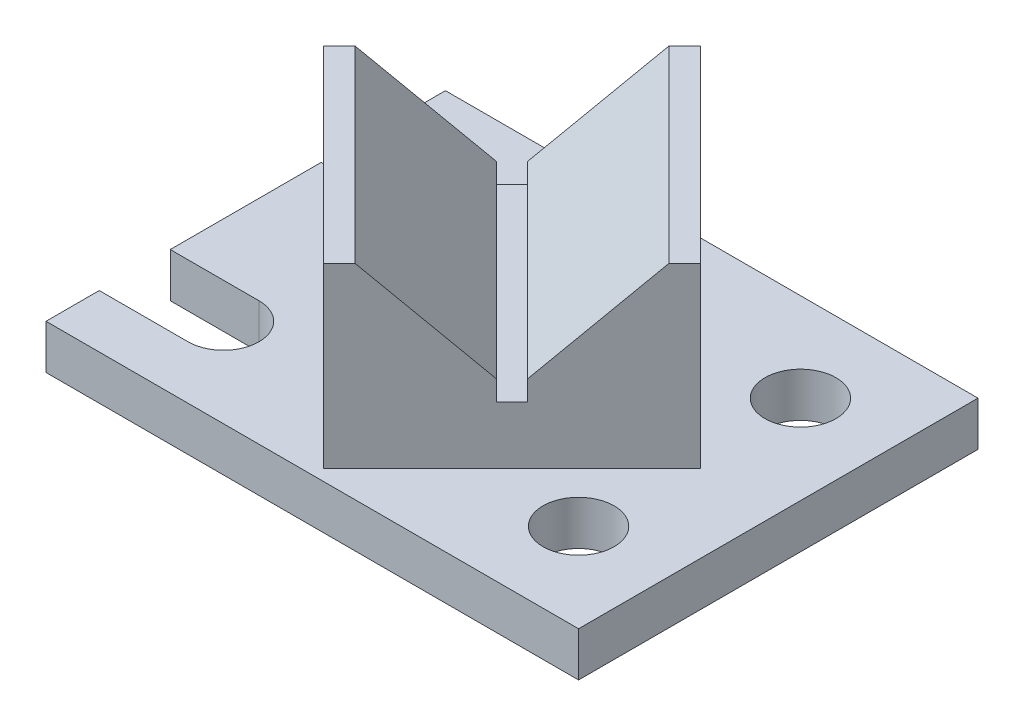
ISO-10303-21;
HEADER;
FILE_DESCRIPTION(('STEP AP214'),'2;1');
FILE_NAME('part.step','',(''),(''),'','','');
FILE_SCHEMA(('AUTOMOTIVE_DESIGN { 1 0 10303 214 1 1 1 1 }'));
ENDSEC;
DATA;
#1=APPLICATION_CONTEXT('core data for automotive mechanical design processes');
#2=APPLICATION_PROTOCOL_DEFINITION('international standard','automotive_design',2000,#1);
#3=PRODUCT_CONTEXT('',#1,'mechanical');
#4=PRODUCT('Part','Part','',(#3));
#5=PRODUCT_RELATED_PRODUCT_CATEGORY('part','',(#4));
#6=PRODUCT_DEFINITION_FORMATION('','',#4);
#7=PRODUCT_DEFINITION_CONTEXT('part definition',#1,'design');
#8=PRODUCT_DEFINITION('design','',#6,#7);
#9=PRODUCT_DEFINITION_SHAPE('','',#8);
#10=(LENGTH_UNIT() NAMED_UNIT(*) SI_UNIT(.MILLI.,.METRE.));
#11=(NAMED_UNIT(*) PLANE_ANGLE_UNIT() SI_UNIT($,.RADIAN.));
#12=(NAMED_UNIT(*) SI_UNIT($,.STERADIAN.) SOLID_ANGLE_UNIT());
#13=UNCERTAINTY_MEASURE_WITH_UNIT(LENGTH_MEASURE(1.E-05),#10,'distance_accuracy_value','');
#14=(GEOMETRIC_REPRESENTATION_CONTEXT(3) GLOBAL_UNCERTAINTY_ASSIGNED_CONTEXT((#13)) GLOBAL_UNIT_ASSIGNED_CONTEXT((#10,
#11,#12)) REPRESENTATION_CONTEXT('',''));
#15=CARTESIAN_POINT('',(0.,0.,0.));
#16=DIRECTION('',(0.,0.,1.));
#17=DIRECTION('',(1.,0.,0.));
#18=AXIS2_PLACEMENT_3D('',#15,#16,#17);
#19=CARTESIAN_POINT('',(0.,63.5,0.));
#20=DIRECTION('',(0.,1.,0.));
#21=DIRECTION('',(0.,0.,1.));
#22=AXIS2_PLACEMENT_3D('',#19,#20,#21);
#23=PLANE('',#22);
#24=DIRECTION('',(0.707106781186549,0.,0.707106781186546));
#25=VECTOR('',#24,1.);
#26=CARTESIAN_POINT('',(-22.4506403026728,63.5,22.4506403026729));
#27=LINE('',#26,#25);
#28=CARTESIAN_POINT('',(-49.3914086658803,63.5,-4.49012806053449));
#29=VERTEX_POINT('',#28);
#30=CARTESIAN_POINT('',(4.49012806053468,63.5,49.3914086658803));
#31=VERTEX_POINT('',#30);
#32=EDGE_CURVE('E364',#29,#31,#27,.T.);
#33=ORIENTED_EDGE('',*,*,#32,.F.);
#34=DIRECTION('',(-0.707106781186546,0.,0.707106781186549));
#35=VECTOR('',#34,1.);
#36=CARTESIAN_POINT('',(0.,63.5,-53.8815367264149));
#37=LINE('',#36,#35);
#38=CARTESIAN_POINT('',(-53.8815367264149,63.5,0.));
#39=VERTEX_POINT('',#38);
#40=EDGE_CURVE('E238',#29,#39,#37,.T.);
#41=ORIENTED_EDGE('',*,*,#40,.T.);
#42=DIRECTION('',(0.707106781186549,0.,0.707106781186546));
#43=VECTOR('',#42,1.);
#44=CARTESIAN_POINT('',(1.07552855510562E-13,63.5,53.8815367264149));
#45=LINE('',#44,#43);
#46=CARTESIAN_POINT('',(1.07552855510562E-13,63.5,53.8815367264149));
#47=VERTEX_POINT('',#46);
#48=EDGE_CURVE('E228',#39,#47,#45,.T.);
#49=ORIENTED_EDGE('',*,*,#48,.T.);
#50=DIRECTION('',(0.707106781186546,0.,-0.707106781186549));
#51=VECTOR('',#50,1.);
#52=CARTESIAN_POINT('',(53.8815367264149,63.5,0.));
#53=LINE('',#52,#51);
#54=EDGE_CURVE('E233',#47,#31,#53,.T.);
#55=ORIENTED_EDGE('',*,*,#54,.T.);
#56=EDGE_LOOP('',(#33,#41,#49,#55));
#57=FACE_BOUND('',#56,.T.);
#58=ADVANCED_FACE('F39',(#57),#23,.T.);
#59=CARTESIAN_POINT('',(0.,12.7,0.));
#60=DIRECTION('',(0.,-1.,0.));
#61=DIRECTION('',(0.,0.,-1.));
#62=AXIS2_PLACEMENT_3D('',#59,#60,#61);
#63=PLANE('',#62);
#64=CARTESIAN_POINT('',(50.8,12.7,-31.75));
#65=DIRECTION('',(0.,-1.,0.));
#66=DIRECTION('',(0.,0.,-1.));
#67=AXIS2_PLACEMENT_3D('',#64,#65,#66);
#68=CIRCLE('',#67,10.16);
#69=CARTESIAN_POINT('',(50.8,12.7,-41.91));
#70=VERTEX_POINT('',#69);
#71=EDGE_CURVE('E267',#70,#70,#68,.T.);
#72=ORIENTED_EDGE('',*,*,#71,.T.);
#73=EDGE_LOOP('',(#72));
#74=FACE_BOUND('',#73,.T.);
#75=DIRECTION('',(1.,0.,0.));
#76=VECTOR('',#75,1.);
#77=CARTESIAN_POINT('',(-76.2,12.7,-41.91));
#78=LINE('',#77,#76);
#79=CARTESIAN_POINT('',(-76.2,12.7,-41.91));
#80=VERTEX_POINT('',#79);
#81=CARTESIAN_POINT('',(-50.8,12.7,-41.91));
#82=VERTEX_POINT('',#81);
#83=EDGE_CURVE('E274',#80,#82,#78,.T.);
#84=ORIENTED_EDGE('',*,*,#83,.T.);
#85=CARTESIAN_POINT('',(-50.8,12.7,-31.75));
#86=DIRECTION('',(0.,-1.,0.));
#87=DIRECTION('',(0.,0.,1.));
#88=AXIS2_PLACEMENT_3D('',#85,#86,#87);
#89=CIRCLE('',#88,10.16);
#90=CARTESIAN_POINT('',(-50.8,12.7,-21.59));
#91=VERTEX_POINT('',#90);
#92=EDGE_CURVE('E282',#82,#91,#89,.T.);
#93=ORIENTED_EDGE('',*,*,#92,.T.);
#94=DIRECTION('',(-1.,0.,0.));
#95=VECTOR('',#94,1.);
#96=CARTESIAN_POINT('',(-76.2,12.7,-21.59));
#97=LINE('',#96,#95);
#98=CARTESIAN_POINT('',(-76.2,12.7,-21.59));
#99=VERTEX_POINT('',#98);
#100=EDGE_CURVE('E262',#91,#99,#97,.T.);
#101=ORIENTED_EDGE('',*,*,#100,.T.);
#102=DIRECTION('',(0.,0.,1.));
#103=VECTOR('',#102,1.);
#104=CARTESIAN_POINT('',(-76.2,12.7,57.15));
#105=LINE('',#104,#103);
#106=CARTESIAN_POINT('',(-76.2,12.7,21.59));
#107=VERTEX_POINT('',#106);
#108=EDGE_CURVE('E338',#99,#107,#105,.T.);
#109=ORIENTED_EDGE('',*,*,#108,.T.);
#110=DIRECTION('',(-1.,0.,0.));
#111=VECTOR('',#110,1.);
#112=CARTESIAN_POINT('',(-76.2,12.7,21.59));
#113=LINE('',#112,#111);
#114=CARTESIAN_POINT('',(-50.8,12.7,21.59));
#115=VERTEX_POINT('',#114);
#116=EDGE_CURVE('E311',#115,#107,#113,.T.);
#117=ORIENTED_EDGE('',*,*,#116,.F.);
#118=CARTESIAN_POINT('',(-50.8,12.7,31.75));
#119=DIRECTION('',(0.,1.,0.));
#120=DIRECTION('',(0.,0.,-1.));
#121=AXIS2_PLACEMENT_3D('',#118,#119,#120);
#122=CIRCLE('',#121,10.16);
#123=CARTESIAN_POINT('',(-50.8,12.7,41.91));
#124=VERTEX_POINT('',#123);
#125=EDGE_CURVE('E314',#124,#115,#122,.T.);
#126=ORIENTED_EDGE('',*,*,#125,.F.);
#127=DIRECTION('',(1.,0.,0.));
#128=VECTOR('',#127,1.);
#129=CARTESIAN_POINT('',(-76.2,12.7,41.91));
#130=LINE('',#129,#128);
#131=CARTESIAN_POINT('',(-76.2,12.7,41.91));
#132=VERTEX_POINT('',#131);
#133=EDGE_CURVE('E301',#132,#124,#130,.T.);
#134=ORIENTED_EDGE('',*,*,#133,.F.);
#135=CARTESIAN_POINT('',(-76.2,12.7,57.15));
#136=VERTEX_POINT('',#135);
#137=EDGE_CURVE('E333',#132,#136,#105,.T.);
#138=ORIENTED_EDGE('',*,*,#137,.T.);
#139=DIRECTION('',(1.,0.,0.));
#140=VECTOR('',#139,1.);
#141=CARTESIAN_POINT('',(-76.2,12.7,57.15));
#142=LINE('',#141,#140);
#143=CARTESIAN_POINT('',(76.2,12.7,57.15));
#144=VERTEX_POINT('',#143);
#145=EDGE_CURVE('E337',#136,#144,#142,.T.);
#146=ORIENTED_EDGE('',*,*,#145,.T.);
#147=DIRECTION('',(0.,0.,-1.));
#148=VECTOR('',#147,1.);
#149=CARTESIAN_POINT('',(76.2,12.7,57.15));
#150=LINE('',#149,#148);
#151=CARTESIAN_POINT('',(76.2,12.7,-57.15));
#152=VERTEX_POINT('',#151);
#153=EDGE_CURVE('E327',#144,#152,#150,.T.);
#154=ORIENTED_EDGE('',*,*,#153,.T.);
#155=DIRECTION('',(-1.,0.,0.));
#156=VECTOR('',#155,1.);
#157=CARTESIAN_POINT('',(-76.2,12.7,-57.15));
#158=LINE('',#157,#156);
#159=CARTESIAN_POINT('',(-76.2,12.7,-57.15));
#160=VERTEX_POINT('',#159);
#161=EDGE_CURVE('E330',#152,#160,#158,.T.);
#162=ORIENTED_EDGE('',*,*,#161,.T.);
#163=EDGE_CURVE('E334',#160,#80,#105,.T.);
#164=ORIENTED_EDGE('',*,*,#163,.T.);
#165=EDGE_LOOP('',(#84,#93,#101,#109,#117,#126,#134,#138,#146,#154,#162,#164));
#166=FACE_BOUND('',#165,.T.);
#167=CARTESIAN_POINT('',(50.8,12.7,31.75));
#168=DIRECTION('',(0.,1.,0.));
#169=DIRECTION('',(0.,0.,1.));
#170=AXIS2_PLACEMENT_3D('',#167,#168,#169);
#171=CIRCLE('',#170,10.16);
#172=CARTESIAN_POINT('',(50.8,12.7,41.91));
#173=VERTEX_POINT('',#172);
#174=EDGE_CURVE('E298',#173,#173,#171,.T.);
#175=ORIENTED_EDGE('',*,*,#174,.F.);
#176=EDGE_LOOP('',(#175));
#177=FACE_BOUND('',#176,.T.);
#178=DIRECTION('',(0.707106781186549,0.,0.707106781186546));
#179=VECTOR('',#178,1.);
#180=CARTESIAN_POINT('',(1.07552855510562E-13,12.7,53.8815367264149));
#181=LINE('',#180,#179);
#182=CARTESIAN_POINT('',(-53.8815367264149,12.7,0.));
#183=VERTEX_POINT('',#182);
#184=CARTESIAN_POINT('',(1.07552855510562E-13,12.7,53.8815367264149));
#185=VERTEX_POINT('',#184);
#186=EDGE_CURVE('E62',#183,#185,#181,.T.);
#187=ORIENTED_EDGE('',*,*,#186,.F.);
#188=DIRECTION('',(-0.707106781186546,0.,0.707106781186549));
#189=VECTOR('',#188,1.);
#190=CARTESIAN_POINT('',(0.,12.7,-53.8815367264149));
#191=LINE('',#190,#189);
#192=CARTESIAN_POINT('',(0.,12.7,-53.8815367264149));
#193=VERTEX_POINT('',#192);
#194=EDGE_CURVE('E232',#193,#183,#191,.T.);
#195=ORIENTED_EDGE('',*,*,#194,.F.);
#196=DIRECTION('',(-0.707106781186549,0.,-0.707106781186546));
#197=VECTOR('',#196,1.);
#198=CARTESIAN_POINT('',(53.8815367264149,12.7,0.));
#199=LINE('',#198,#197);
#200=CARTESIAN_POINT('',(53.8815367264149,12.7,0.));
#201=VERTEX_POINT('',#200);
#202=EDGE_CURVE('E247',#201,#193,#199,.T.);
#203=ORIENTED_EDGE('',*,*,#202,.F.);
#204=DIRECTION('',(0.707106781186546,0.,-0.707106781186549));
#205=VECTOR('',#204,1.);
#206=CARTESIAN_POINT('',(53.8815367264149,12.7,0.));
#207=LINE('',#206,#205);
#208=EDGE_CURVE('E244',#185,#201,#207,.T.);
#209=ORIENTED_EDGE('',*,*,#208,.F.);
#210=EDGE_LOOP('',(#187,#195,#203,#209));
#211=FACE_BOUND('',#210,.T.);
#212=ADVANCED_FACE('F401',(#74,#166,#177,#211),#63,.F.);
#213=CARTESIAN_POINT('',(-76.2,12.7,57.15));
#214=DIRECTION('',(1.,0.,0.));
#215=DIRECTION('',(0.,0.,-1.));
#216=AXIS2_PLACEMENT_3D('',#213,#214,#215);
#217=PLANE('',#216);
#218=DIRECTION('',(0.,1.,0.));
#219=VECTOR('',#218,1.);
#220=CARTESIAN_POINT('',(-76.2,0.,-41.91));
#221=LINE('',#220,#219);
#222=CARTESIAN_POINT('',(-76.2,0.,-41.91));
#223=VERTEX_POINT('',#222);
#224=EDGE_CURVE('E270',#223,#80,#221,.T.);
#225=ORIENTED_EDGE('',*,*,#224,.T.);
#226=ORIENTED_EDGE('',*,*,#163,.F.);
#227=DIRECTION('',(0.,-1.,0.));
#228=VECTOR('',#227,1.);
#229=CARTESIAN_POINT('',(-76.2,12.7,-57.15));
#230=LINE('',#229,#228);
#231=CARTESIAN_POINT('',(-76.2,0.,-57.15));
#232=VERTEX_POINT('',#231);
#233=EDGE_CURVE('E356',#160,#232,#230,.T.);
#234=ORIENTED_EDGE('',*,*,#233,.T.);
#235=DIRECTION('',(0.,0.,1.));
#236=VECTOR('',#235,1.);
#237=CARTESIAN_POINT('',(-76.2,0.,57.15));
#238=LINE('',#237,#236);
#239=EDGE_CURVE('E346',#232,#223,#238,.T.);
#240=ORIENTED_EDGE('',*,*,#239,.T.);
#241=EDGE_LOOP('',(#225,#226,#234,#240));
#242=FACE_BOUND('',#241,.T.);
#243=ADVANCED_FACE('F408',(#242),#217,.F.);
#244=DIRECTION('',(0.,1.,0.));
#245=VECTOR('',#244,1.);
#246=CARTESIAN_POINT('',(-76.2,0.,-21.59));
#247=LINE('',#246,#245);
#248=CARTESIAN_POINT('',(-76.2,0.,-21.59));
#249=VERTEX_POINT('',#248);
#250=EDGE_CURVE('E279',#249,#99,#247,.T.);
#251=ORIENTED_EDGE('',*,*,#250,.F.);
#252=CARTESIAN_POINT('',(-76.2,0.,21.59));
#253=VERTEX_POINT('',#252);
#254=EDGE_CURVE('E349',#249,#253,#238,.T.);
#255=ORIENTED_EDGE('',*,*,#254,.T.);
#256=DIRECTION('',(0.,1.,0.));
#257=VECTOR('',#256,1.);
#258=CARTESIAN_POINT('',(-76.2,0.,21.59));
#259=LINE('',#258,#257);
#260=EDGE_CURVE('E266',#253,#107,#259,.T.);
#261=ORIENTED_EDGE('',*,*,#260,.T.);
#262=ORIENTED_EDGE('',*,*,#108,.F.);
#263=EDGE_LOOP('',(#251,#255,#261,#262));
#264=FACE_BOUND('',#263,.T.);
#265=ADVANCED_FACE('F461',(#264),#217,.F.);
#266=CARTESIAN_POINT('',(0.,0.,0.));
#267=DIRECTION('',(0.,-1.,0.));
#268=DIRECTION('',(0.,0.,-1.));
#269=AXIS2_PLACEMENT_3D('',#266,#267,#268);
#270=PLANE('',#269);
#271=CARTESIAN_POINT('',(-50.8,0.,-31.75));
#272=DIRECTION('',(0.,-1.,0.));
#273=DIRECTION('',(0.,0.,1.));
#274=AXIS2_PLACEMENT_3D('',#271,#272,#273);
#275=CIRCLE('',#274,10.16);
#276=CARTESIAN_POINT('',(-50.8,0.,-41.91));
#277=VERTEX_POINT('',#276);
#278=CARTESIAN_POINT('',(-50.8,0.,-21.59));
#279=VERTEX_POINT('',#278);
#280=EDGE_CURVE('E273',#277,#279,#275,.T.);
#281=ORIENTED_EDGE('',*,*,#280,.F.);
#282=DIRECTION('',(1.,0.,0.));
#283=VECTOR('',#282,1.);
#284=CARTESIAN_POINT('',(-76.2,0.,-41.91));
#285=LINE('',#284,#283);
#286=EDGE_CURVE('E277',#223,#277,#285,.T.);
#287=ORIENTED_EDGE('',*,*,#286,.F.);
#288=ORIENTED_EDGE('',*,*,#239,.F.);
#289=DIRECTION('',(-1.,0.,0.));
#290=VECTOR('',#289,1.);
#291=CARTESIAN_POINT('',(-76.2,0.,-57.15));
#292=LINE('',#291,#290);
#293=CARTESIAN_POINT('',(76.2,0.,-57.15));
#294=VERTEX_POINT('',#293);
#295=EDGE_CURVE('E343',#294,#232,#292,.T.);
#296=ORIENTED_EDGE('',*,*,#295,.F.);
#297=DIRECTION('',(0.,0.,-1.));
#298=VECTOR('',#297,1.);
#299=CARTESIAN_POINT('',(76.2,0.,57.15));
#300=LINE('',#299,#298);
#301=CARTESIAN_POINT('',(76.2,0.,57.15));
#302=VERTEX_POINT('',#301);
#303=EDGE_CURVE('E297',#302,#294,#300,.T.);
#304=ORIENTED_EDGE('',*,*,#303,.F.);
#305=DIRECTION('',(1.,0.,0.));
#306=VECTOR('',#305,1.);
#307=CARTESIAN_POINT('',(-76.2,0.,57.15));
#308=LINE('',#307,#306);
#309=CARTESIAN_POINT('',(-76.2,0.,57.15));
#310=VERTEX_POINT('',#309);
#311=EDGE_CURVE('E331',#310,#302,#308,.T.);
#312=ORIENTED_EDGE('',*,*,#311,.F.);
#313=CARTESIAN_POINT('',(-76.2,0.,41.91));
#314=VERTEX_POINT('',#313);
#315=EDGE_CURVE('E345',#314,#310,#238,.T.);
#316=ORIENTED_EDGE('',*,*,#315,.F.);
#317=DIRECTION('',(1.,0.,0.));
#318=VECTOR('',#317,1.);
#319=CARTESIAN_POINT('',(-76.2,0.,41.91));
#320=LINE('',#319,#318);
#321=CARTESIAN_POINT('',(-50.8,0.,41.91));
#322=VERTEX_POINT('',#321);
#323=EDGE_CURVE('E315',#314,#322,#320,.T.);
#324=ORIENTED_EDGE('',*,*,#323,.T.);
#325=CARTESIAN_POINT('',(-50.8,0.,31.75));
#326=DIRECTION('',(0.,1.,0.));
#327=DIRECTION('',(0.,0.,-1.));
#328=AXIS2_PLACEMENT_3D('',#325,#326,#327);
#329=CIRCLE('',#328,10.16);
#330=CARTESIAN_POINT('',(-50.8,0.,21.59));
#331=VERTEX_POINT('',#330);
#332=EDGE_CURVE('E322',#322,#331,#329,.T.);
#333=ORIENTED_EDGE('',*,*,#332,.T.);
#334=DIRECTION('',(-1.,0.,0.));
#335=VECTOR('',#334,1.);
#336=CARTESIAN_POINT('',(-76.2,0.,21.59));
#337=LINE('',#336,#335);
#338=EDGE_CURVE('E304',#331,#253,#337,.T.);
#339=ORIENTED_EDGE('',*,*,#338,.T.);
#340=ORIENTED_EDGE('',*,*,#254,.F.);
#341=DIRECTION('',(-1.,0.,0.));
#342=VECTOR('',#341,1.);
#343=CARTESIAN_POINT('',(-76.2,0.,-21.59));
#344=LINE('',#343,#342);
#345=EDGE_CURVE('E271',#279,#249,#344,.T.);
#346=ORIENTED_EDGE('',*,*,#345,.F.);
#347=EDGE_LOOP('',(#281,#287,#288,#296,#304,#312,#316,#324,#333,#339,#340,#346));
#348=FACE_BOUND('',#347,.T.);
#349=CARTESIAN_POINT('',(50.8,0.,31.75));
#350=DIRECTION('',(0.,1.,0.));
#351=DIRECTION('',(0.,0.,1.));
#352=AXIS2_PLACEMENT_3D('',#349,#350,#351);
#353=CIRCLE('',#352,10.16);
#354=CARTESIAN_POINT('',(50.8,0.,41.91));
#355=VERTEX_POINT('',#354);
#356=EDGE_CURVE('E294',#355,#355,#353,.T.);
#357=ORIENTED_EDGE('',*,*,#356,.T.);
#358=EDGE_LOOP('',(#357));
#359=FACE_BOUND('',#358,.T.);
#360=CARTESIAN_POINT('',(50.8,0.,-31.75));
#361=DIRECTION('',(0.,-1.,0.));
#362=DIRECTION('',(0.,0.,-1.));
#363=AXIS2_PLACEMENT_3D('',#360,#361,#362);
#364=CIRCLE('',#363,10.16);
#365=CARTESIAN_POINT('',(50.8,0.,-41.91));
#366=VERTEX_POINT('',#365);
#367=EDGE_CURVE('E263',#366,#366,#364,.T.);
#368=ORIENTED_EDGE('',*,*,#367,.F.);
#369=EDGE_LOOP('',(#368));
#370=FACE_BOUND('',#369,.T.);
#371=ADVANCED_FACE('F458',(#348,#359,#370),#270,.T.);
#372=CARTESIAN_POINT('',(76.2,12.7,57.15));
#373=DIRECTION('',(-1.,0.,0.));
#374=DIRECTION('',(0.,0.,1.));
#375=AXIS2_PLACEMENT_3D('',#372,#373,#374);
#376=PLANE('',#375);
#377=ORIENTED_EDGE('',*,*,#303,.T.);
#378=DIRECTION('',(0.,-1.,0.));
#379=VECTOR('',#378,1.);
#380=CARTESIAN_POINT('',(76.2,12.7,-57.15));
#381=LINE('',#380,#379);
#382=EDGE_CURVE('E359',#152,#294,#381,.T.);
#383=ORIENTED_EDGE('',*,*,#382,.F.);
#384=ORIENTED_EDGE('',*,*,#153,.F.);
#385=DIRECTION('',(0.,-1.,0.));
#386=VECTOR('',#385,1.);
#387=CARTESIAN_POINT('',(76.2,12.7,57.15));
#388=LINE('',#387,#386);
#389=EDGE_CURVE('E340',#144,#302,#388,.T.);
#390=ORIENTED_EDGE('',*,*,#389,.T.);
#391=EDGE_LOOP('',(#377,#383,#384,#390));
#392=FACE_BOUND('',#391,.T.);
#393=ADVANCED_FACE('F41',(#392),#376,.F.);
#394=CARTESIAN_POINT('',(-76.2,12.7,-57.15));
#395=DIRECTION('',(0.,0.,1.));
#396=DIRECTION('',(1.,0.,0.));
#397=AXIS2_PLACEMENT_3D('',#394,#395,#396);
#398=PLANE('',#397);
#399=ORIENTED_EDGE('',*,*,#295,.T.);
#400=ORIENTED_EDGE('',*,*,#233,.F.);
#401=ORIENTED_EDGE('',*,*,#161,.F.);
#402=ORIENTED_EDGE('',*,*,#382,.T.);
#403=EDGE_LOOP('',(#399,#400,#401,#402));
#404=FACE_BOUND('',#403,.T.);
#405=ADVANCED_FACE('F468',(#404),#398,.F.);
#406=ORIENTED_EDGE('',*,*,#137,.F.);
#407=DIRECTION('',(0.,1.,0.));
#408=VECTOR('',#407,1.);
#409=CARTESIAN_POINT('',(-76.2,0.,41.91));
#410=LINE('',#409,#408);
#411=EDGE_CURVE('E302',#314,#132,#410,.T.);
#412=ORIENTED_EDGE('',*,*,#411,.F.);
#413=ORIENTED_EDGE('',*,*,#315,.T.);
#414=DIRECTION('',(0.,-1.,0.));
#415=VECTOR('',#414,1.);
#416=CARTESIAN_POINT('',(-76.2,12.7,57.15));
#417=LINE('',#416,#415);
#418=EDGE_CURVE('E353',#136,#310,#417,.T.);
#419=ORIENTED_EDGE('',*,*,#418,.F.);
#420=EDGE_LOOP('',(#406,#412,#413,#419));
#421=FACE_BOUND('',#420,.T.);
#422=ADVANCED_FACE('F465',(#421),#217,.F.);
#423=CARTESIAN_POINT('',(-76.2,12.7,57.15));
#424=DIRECTION('',(0.,0.,-1.));
#425=DIRECTION('',(-1.,0.,0.));
#426=AXIS2_PLACEMENT_3D('',#423,#424,#425);
#427=PLANE('',#426);
#428=ORIENTED_EDGE('',*,*,#311,.T.);
#429=ORIENTED_EDGE('',*,*,#389,.F.);
#430=ORIENTED_EDGE('',*,*,#145,.F.);
#431=ORIENTED_EDGE('',*,*,#418,.T.);
#432=EDGE_LOOP('',(#428,#429,#430,#431));
#433=FACE_BOUND('',#432,.T.);
#434=ADVANCED_FACE('F455',(#433),#427,.F.);
#435=CARTESIAN_POINT('',(-76.2,0.,21.59));
#436=DIRECTION('',(0.,0.,-1.));
#437=DIRECTION('',(-1.,0.,0.));
#438=AXIS2_PLACEMENT_3D('',#435,#436,#437);
#439=PLANE('',#438);
#440=ORIENTED_EDGE('',*,*,#116,.T.);
#441=ORIENTED_EDGE('',*,*,#260,.F.);
#442=ORIENTED_EDGE('',*,*,#338,.F.);
#443=DIRECTION('',(0.,1.,0.));
#444=VECTOR('',#443,1.);
#445=CARTESIAN_POINT('',(-50.8,0.,21.59));
#446=LINE('',#445,#444);
#447=EDGE_CURVE('E307',#331,#115,#446,.T.);
#448=ORIENTED_EDGE('',*,*,#447,.T.);
#449=EDGE_LOOP('',(#440,#441,#442,#448));
#450=FACE_BOUND('',#449,.T.);
#451=ADVANCED_FACE('F452',(#450),#439,.F.);
#452=CARTESIAN_POINT('',(-50.8,0.,31.75));
#453=DIRECTION('',(0.,1.,0.));
#454=DIRECTION('',(0.,0.,1.));
#455=AXIS2_PLACEMENT_3D('',#452,#453,#454);
#456=CYLINDRICAL_SURFACE('',#455,10.16);
#457=ORIENTED_EDGE('',*,*,#125,.T.);
#458=ORIENTED_EDGE('',*,*,#447,.F.);
#459=ORIENTED_EDGE('',*,*,#332,.F.);
#460=DIRECTION('',(0.,1.,0.));
#461=VECTOR('',#460,1.);
#462=CARTESIAN_POINT('',(-50.8,0.,41.91));
#463=LINE('',#462,#461);
#464=EDGE_CURVE('E305',#322,#124,#463,.T.);
#465=ORIENTED_EDGE('',*,*,#464,.T.);
#466=EDGE_LOOP('',(#457,#458,#459,#465));
#467=FACE_BOUND('',#466,.T.);
#468=ADVANCED_FACE('F448',(#467),#456,.F.);
#469=CARTESIAN_POINT('',(-76.2,0.,41.91));
#470=DIRECTION('',(0.,0.,1.));
#471=DIRECTION('',(1.,0.,0.));
#472=AXIS2_PLACEMENT_3D('',#469,#470,#471);
#473=PLANE('',#472);
#474=ORIENTED_EDGE('',*,*,#133,.T.);
#475=ORIENTED_EDGE('',*,*,#464,.F.);
#476=ORIENTED_EDGE('',*,*,#323,.F.);
#477=ORIENTED_EDGE('',*,*,#411,.T.);
#478=EDGE_LOOP('',(#474,#475,#476,#477));
#479=FACE_BOUND('',#478,.T.);
#480=ADVANCED_FACE('F444',(#479),#473,.F.);
#481=CARTESIAN_POINT('',(50.8,0.,31.75));
#482=DIRECTION('',(0.,1.,0.));
#483=DIRECTION('',(0.,0.,1.));
#484=AXIS2_PLACEMENT_3D('',#481,#482,#483);
#485=CYLINDRICAL_SURFACE('',#484,10.16);
#486=ORIENTED_EDGE('',*,*,#356,.F.);
#487=EDGE_LOOP('',(#486));
#488=FACE_BOUND('',#487,.T.);
#489=ORIENTED_EDGE('',*,*,#174,.T.);
#490=EDGE_LOOP('',(#489));
#491=FACE_BOUND('',#490,.T.);
#492=ADVANCED_FACE('F434',(#488,#491),#485,.F.);
#493=CARTESIAN_POINT('',(-76.2,0.,-41.91));
#494=DIRECTION('',(0.,0.,1.));
#495=DIRECTION('',(1.,0.,0.));
#496=AXIS2_PLACEMENT_3D('',#493,#494,#495);
#497=PLANE('',#496);
#498=ORIENTED_EDGE('',*,*,#83,.F.);
#499=ORIENTED_EDGE('',*,*,#224,.F.);
#500=ORIENTED_EDGE('',*,*,#286,.T.);
#501=DIRECTION('',(0.,1.,0.));
#502=VECTOR('',#501,1.);
#503=CARTESIAN_POINT('',(-50.8,0.,-41.91));
#504=LINE('',#503,#502);
#505=EDGE_CURVE('E289',#277,#82,#504,.T.);
#506=ORIENTED_EDGE('',*,*,#505,.T.);
#507=EDGE_LOOP('',(#498,#499,#500,#506));
#508=FACE_BOUND('',#507,.T.);
#509=ADVANCED_FACE('F430',(#508),#497,.T.);
#510=CARTESIAN_POINT('',(-50.8,0.,-31.75));
#511=DIRECTION('',(0.,1.,0.));
#512=DIRECTION('',(0.,0.,1.));
#513=AXIS2_PLACEMENT_3D('',#510,#511,#512);
#514=CYLINDRICAL_SURFACE('',#513,10.16);
#515=ORIENTED_EDGE('',*,*,#92,.F.);
#516=ORIENTED_EDGE('',*,*,#505,.F.);
#517=ORIENTED_EDGE('',*,*,#280,.T.);
#518=DIRECTION('',(0.,1.,0.));
#519=VECTOR('',#518,1.);
#520=CARTESIAN_POINT('',(-50.8,0.,-21.59));
#521=LINE('',#520,#519);
#522=EDGE_CURVE('E291',#279,#91,#521,.T.);
#523=ORIENTED_EDGE('',*,*,#522,.T.);
#524=EDGE_LOOP('',(#515,#516,#517,#523));
#525=FACE_BOUND('',#524,.T.);
#526=ADVANCED_FACE('F433',(#525),#514,.F.);
#527=CARTESIAN_POINT('',(-76.2,0.,-21.59));
#528=DIRECTION('',(0.,0.,-1.));
#529=DIRECTION('',(-1.,0.,0.));
#530=AXIS2_PLACEMENT_3D('',#527,#528,#529);
#531=PLANE('',#530);
#532=ORIENTED_EDGE('',*,*,#100,.F.);
#533=ORIENTED_EDGE('',*,*,#522,.F.);
#534=ORIENTED_EDGE('',*,*,#345,.T.);
#535=ORIENTED_EDGE('',*,*,#250,.T.);
#536=EDGE_LOOP('',(#532,#533,#534,#535));
#537=FACE_BOUND('',#536,.T.);
#538=ADVANCED_FACE('F428',(#537),#531,.T.);
#539=CARTESIAN_POINT('',(50.8,0.,-31.75));
#540=DIRECTION('',(0.,1.,0.));
#541=DIRECTION('',(0.,0.,1.));
#542=AXIS2_PLACEMENT_3D('',#539,#540,#541);
#543=CYLINDRICAL_SURFACE('',#542,10.16);
#544=ORIENTED_EDGE('',*,*,#367,.T.);
#545=EDGE_LOOP('',(#544));
#546=FACE_BOUND('',#545,.T.);
#547=ORIENTED_EDGE('',*,*,#71,.F.);
#548=EDGE_LOOP('',(#547));
#549=FACE_BOUND('',#548,.T.);
#550=ADVANCED_FACE('F425',(#546,#549),#543,.F.);
#551=CARTESIAN_POINT('',(1.07552855510562E-13,63.5,53.8815367264149));
#552=DIRECTION('',(0.707106781186546,0.,-0.707106781186549));
#553=DIRECTION('',(-0.707106781186549,0.,-0.707106781186546));
#554=AXIS2_PLACEMENT_3D('',#551,#552,#553);
#555=PLANE('',#554);
#556=ORIENTED_EDGE('',*,*,#186,.T.);
#557=DIRECTION('',(0.,-1.,0.));
#558=VECTOR('',#557,1.);
#559=CARTESIAN_POINT('',(1.07552855510562E-13,63.5,53.8815367264149));
#560=LINE('',#559,#558);
#561=EDGE_CURVE('E259',#47,#185,#560,.T.);
#562=ORIENTED_EDGE('',*,*,#561,.F.);
#563=ORIENTED_EDGE('',*,*,#48,.F.);
#564=DIRECTION('',(0.,-1.,0.));
#565=VECTOR('',#564,1.);
#566=CARTESIAN_POINT('',(-53.8815367264149,63.5,0.));
#567=LINE('',#566,#565);
#568=EDGE_CURVE('E242',#39,#183,#567,.T.);
#569=ORIENTED_EDGE('',*,*,#568,.T.);
#570=EDGE_LOOP('',(#556,#562,#563,#569));
#571=FACE_BOUND('',#570,.T.);
#572=ADVANCED_FACE('F386',(#571),#555,.F.);
#573=CARTESIAN_POINT('',(53.8815367264149,63.5,0.));
#574=DIRECTION('',(-0.707106781186549,0.,-0.707106781186546));
#575=DIRECTION('',(-0.707106781186546,0.,0.707106781186549));
#576=AXIS2_PLACEMENT_3D('',#573,#574,#575);
#577=PLANE('',#576);
#578=DIRECTION('',(0.,-1.,0.));
#579=VECTOR('',#578,1.);
#580=CARTESIAN_POINT('',(24.6957043329402,34.9250000000002,29.1858323934747));
#581=LINE('',#580,#579);
#582=CARTESIAN_POINT('',(24.6957043329402,34.9250000000002,29.1858323934747));
#583=VERTEX_POINT('',#582);
#584=CARTESIAN_POINT('',(24.6957043329402,29.21,29.1858323934747));
#585=VERTEX_POINT('',#584);
#586=EDGE_CURVE('E202',#583,#585,#581,.T.);
#587=ORIENTED_EDGE('',*,*,#586,.F.);
#588=DIRECTION('',(0.5,-0.707106781186546,-0.500000000000002));
#589=VECTOR('',#588,1.);
#590=CARTESIAN_POINT('',(4.49012806053468,63.5,49.3914086658803));
#591=LINE('',#590,#589);
#592=EDGE_CURVE('E199',#31,#583,#591,.T.);
#593=ORIENTED_EDGE('',*,*,#592,.F.);
#594=ORIENTED_EDGE('',*,*,#54,.F.);
#595=ORIENTED_EDGE('',*,*,#561,.T.);
#596=ORIENTED_EDGE('',*,*,#208,.T.);
#597=DIRECTION('',(0.,-1.,0.));
#598=VECTOR('',#597,1.);
#599=CARTESIAN_POINT('',(53.8815367264149,63.5,0.));
#600=LINE('',#599,#598);
#601=CARTESIAN_POINT('',(53.8815367264149,63.5,0.));
#602=VERTEX_POINT('',#601);
#603=EDGE_CURVE('E256',#602,#201,#600,.T.);
#604=ORIENTED_EDGE('',*,*,#603,.F.);
#605=CARTESIAN_POINT('',(49.3914086658803,63.5,4.49012806053452));
#606=VERTEX_POINT('',#605);
#607=EDGE_CURVE('E231',#606,#602,#53,.T.);
#608=ORIENTED_EDGE('',*,*,#607,.F.);
#609=DIRECTION('',(0.5,0.707106781186546,-0.500000000000002));
#610=VECTOR('',#609,1.);
#611=CARTESIAN_POINT('',(49.3914086658804,63.5,4.49012806053451));
#612=LINE('',#611,#610);
#613=CARTESIAN_POINT('',(29.1858323934748,34.9250000000002,24.6957043329401));
#614=VERTEX_POINT('',#613);
#615=EDGE_CURVE('E54',#614,#606,#612,.T.);
#616=ORIENTED_EDGE('',*,*,#615,.F.);
#617=DIRECTION('',(0.,1.,0.));
#618=VECTOR('',#617,1.);
#619=CARTESIAN_POINT('',(29.1858323934748,34.9250000000002,24.6957043329401));
#620=LINE('',#619,#618);
#621=CARTESIAN_POINT('',(29.1858323934748,29.21,24.6957043329401));
#622=VERTEX_POINT('',#621);
#623=EDGE_CURVE('E212',#622,#614,#620,.T.);
#624=ORIENTED_EDGE('',*,*,#623,.F.);
#625=DIRECTION('',(0.707106781186546,0.,-0.707106781186549));
#626=VECTOR('',#625,1.);
#627=CARTESIAN_POINT('',(29.1858323934748,29.21,24.6957043329401));
#628=LINE('',#627,#626);
#629=EDGE_CURVE('E193',#585,#622,#628,.T.);
#630=ORIENTED_EDGE('',*,*,#629,.F.);
#631=EDGE_LOOP('',(#587,#593,#594,#595,#596,#604,#608,#616,#624,#630));
#632=FACE_BOUND('',#631,.T.);
#633=ADVANCED_FACE('F210',(#632),#577,.F.);
#634=CARTESIAN_POINT('',(53.8815367264149,63.5,0.));
#635=DIRECTION('',(-0.707106781186546,0.,0.707106781186549));
#636=DIRECTION('',(0.707106781186549,0.,0.707106781186546));
#637=AXIS2_PLACEMENT_3D('',#634,#635,#636);
#638=PLANE('',#637);
#639=ORIENTED_EDGE('',*,*,#202,.T.);
#640=DIRECTION('',(0.,-1.,0.));
#641=VECTOR('',#640,1.);
#642=CARTESIAN_POINT('',(0.,63.5,-53.8815367264149));
#643=LINE('',#642,#641);
#644=CARTESIAN_POINT('',(0.,63.5,-53.8815367264149));
#645=VERTEX_POINT('',#644);
#646=EDGE_CURVE('E253',#645,#193,#643,.T.);
#647=ORIENTED_EDGE('',*,*,#646,.F.);
#648=DIRECTION('',(-0.707106781186549,0.,-0.707106781186546));
#649=VECTOR('',#648,1.);
#650=CARTESIAN_POINT('',(53.8815367264149,63.5,0.));
#651=LINE('',#650,#649);
#652=EDGE_CURVE('E236',#602,#645,#651,.T.);
#653=ORIENTED_EDGE('',*,*,#652,.F.);
#654=ORIENTED_EDGE('',*,*,#603,.T.);
#655=EDGE_LOOP('',(#639,#647,#653,#654));
#656=FACE_BOUND('',#655,.T.);
#657=ADVANCED_FACE('F382',(#656),#638,.F.);
#658=CARTESIAN_POINT('',(0.,63.5,-53.8815367264149));
#659=DIRECTION('',(0.707106781186549,0.,0.707106781186546));
#660=DIRECTION('',(0.707106781186546,0.,-0.707106781186549));
#661=AXIS2_PLACEMENT_3D('',#658,#659,#660);
#662=PLANE('',#661);
#663=ORIENTED_EDGE('',*,*,#40,.F.);
#664=DIRECTION('',(0.5,-0.707106781186546,-0.500000000000002));
#665=VECTOR('',#664,1.);
#666=CARTESIAN_POINT('',(-24.6957043329401,28.575,-29.1858323934748));
#667=LINE('',#666,#665);
#668=CARTESIAN_POINT('',(-29.1858323934748,34.9250000000002,-24.6957043329401));
#669=VERTEX_POINT('',#668);
#670=EDGE_CURVE('E225',#29,#669,#667,.T.);
#671=ORIENTED_EDGE('',*,*,#670,.T.);
#672=DIRECTION('',(0.,-1.,0.));
#673=VECTOR('',#672,1.);
#674=CARTESIAN_POINT('',(-29.1858323934748,63.5,-24.6957043329401));
#675=LINE('',#674,#673);
#676=CARTESIAN_POINT('',(-29.1858323934748,29.21,-24.6957043329401));
#677=VERTEX_POINT('',#676);
#678=EDGE_CURVE('E11',#669,#677,#675,.T.);
#679=ORIENTED_EDGE('',*,*,#678,.T.);
#680=DIRECTION('',(0.707106781186546,0.,-0.707106781186549));
#681=VECTOR('',#680,1.);
#682=CARTESIAN_POINT('',(0.,29.21,-53.8815367264149));
#683=LINE('',#682,#681);
#684=CARTESIAN_POINT('',(-24.6957043329402,29.21,-29.1858323934747));
#685=VERTEX_POINT('',#684);
#686=EDGE_CURVE('E196',#677,#685,#683,.T.);
#687=ORIENTED_EDGE('',*,*,#686,.T.);
#688=DIRECTION('',(0.,1.,0.));
#689=VECTOR('',#688,1.);
#690=CARTESIAN_POINT('',(-24.6957043329402,63.5,-29.1858323934747));
#691=LINE('',#690,#689);
#692=CARTESIAN_POINT('',(-24.6957043329402,34.9250000000002,-29.1858323934747));
#693=VERTEX_POINT('',#692);
#694=EDGE_CURVE('E47',#685,#693,#691,.T.);
#695=ORIENTED_EDGE('',*,*,#694,.T.);
#696=DIRECTION('',(0.5,0.707106781186546,-0.500000000000002));
#697=VECTOR('',#696,1.);
#698=CARTESIAN_POINT('',(-2.24506403026737,66.675,-51.6364726961476));
#699=LINE('',#698,#697);
#700=CARTESIAN_POINT('',(-4.49012806053466,63.5,-49.3914086658803));
#701=VERTEX_POINT('',#700);
#702=EDGE_CURVE('E219',#693,#701,#699,.T.);
#703=ORIENTED_EDGE('',*,*,#702,.T.);
#704=EDGE_CURVE('E239',#645,#701,#37,.T.);
#705=ORIENTED_EDGE('',*,*,#704,.F.);
#706=ORIENTED_EDGE('',*,*,#646,.T.);
#707=ORIENTED_EDGE('',*,*,#194,.T.);
#708=ORIENTED_EDGE('',*,*,#568,.F.);
#709=EDGE_LOOP('',(#663,#671,#679,#687,#695,#703,#705,#706,#707,#708));
#710=FACE_BOUND('',#709,.T.);
#711=ADVANCED_FACE('F369',(#710),#662,.F.);
#712=DIRECTION('',(-0.707106781186549,0.,-0.707106781186546));
#713=VECTOR('',#712,1.);
#714=CARTESIAN_POINT('',(22.4506403026728,63.5,-22.4506403026729));
#715=LINE('',#714,#713);
#716=EDGE_CURVE('E362',#606,#701,#715,.T.);
#717=ORIENTED_EDGE('',*,*,#716,.F.);
#718=ORIENTED_EDGE('',*,*,#607,.T.);
#719=ORIENTED_EDGE('',*,*,#652,.T.);
#720=ORIENTED_EDGE('',*,*,#704,.T.);
#721=EDGE_LOOP('',(#717,#718,#719,#720));
#722=FACE_BOUND('',#721,.T.);
#723=ADVANCED_FACE('F377',(#722),#23,.T.);
#724=CARTESIAN_POINT('',(-68.9200640302674,34.9250000000002,-64.4299359697326));
#725=DIRECTION('',(-0.707106781186546,0.,0.707106781186549));
#726=DIRECTION('',(0.707106781186549,0.,0.707106781186546));
#727=AXIS2_PLACEMENT_3D('',#724,#725,#726);
#728=PLANE('',#727);
#729=DIRECTION('',(0.707106781186549,0.,0.707106781186546));
#730=VECTOR('',#729,1.);
#731=CARTESIAN_POINT('',(-68.9200640302674,34.9250000000002,-64.4299359697326));
#732=LINE('',#731,#730);
#733=EDGE_CURVE('E205',#669,#583,#732,.T.);
#734=ORIENTED_EDGE('',*,*,#733,.T.);
#735=ORIENTED_EDGE('',*,*,#586,.T.);
#736=DIRECTION('',(0.707106781186549,0.,0.707106781186546));
#737=VECTOR('',#736,1.);
#738=CARTESIAN_POINT('',(-68.9200640302674,29.21,-64.4299359697326));
#739=LINE('',#738,#737);
#740=EDGE_CURVE('E188',#677,#585,#739,.T.);
#741=ORIENTED_EDGE('',*,*,#740,.F.);
#742=ORIENTED_EDGE('',*,*,#678,.F.);
#743=EDGE_LOOP('',(#734,#735,#741,#742));
#744=FACE_BOUND('',#743,.T.);
#745=ADVANCED_FACE('F203',(#744),#728,.F.);
#746=CARTESIAN_POINT('',(-64.4299359697328,34.9250000000002,-68.9200640302672));
#747=DIRECTION('',(0.707106781186546,0.,-0.707106781186549));
#748=DIRECTION('',(-0.707106781186549,0.,-0.707106781186546));
#749=AXIS2_PLACEMENT_3D('',#746,#747,#748);
#750=PLANE('',#749);
#751=DIRECTION('',(0.707106781186549,0.,0.707106781186546));
#752=VECTOR('',#751,1.);
#753=CARTESIAN_POINT('',(-64.4299359697328,29.21,-68.9200640302672));
#754=LINE('',#753,#752);
#755=EDGE_CURVE('E198',#685,#622,#754,.T.);
#756=ORIENTED_EDGE('',*,*,#755,.T.);
#757=ORIENTED_EDGE('',*,*,#623,.T.);
#758=DIRECTION('',(0.707106781186549,0.,0.707106781186546));
#759=VECTOR('',#758,1.);
#760=CARTESIAN_POINT('',(-64.4299359697328,34.9250000000002,-68.9200640302672));
#761=LINE('',#760,#759);
#762=EDGE_CURVE('E220',#693,#614,#761,.T.);
#763=ORIENTED_EDGE('',*,*,#762,.F.);
#764=ORIENTED_EDGE('',*,*,#694,.F.);
#765=EDGE_LOOP('',(#756,#757,#763,#764));
#766=FACE_BOUND('',#765,.T.);
#767=ADVANCED_FACE('F373',(#766),#750,.F.);
#768=CARTESIAN_POINT('',(-64.4299359697328,29.21,-68.9200640302672));
#769=DIRECTION('',(0.,-1.,0.));
#770=DIRECTION('',(0.,0.,-1.));
#771=AXIS2_PLACEMENT_3D('',#768,#769,#770);
#772=PLANE('',#771);
#773=ORIENTED_EDGE('',*,*,#740,.T.);
#774=ORIENTED_EDGE('',*,*,#629,.T.);
#775=ORIENTED_EDGE('',*,*,#755,.F.);
#776=ORIENTED_EDGE('',*,*,#686,.F.);
#777=EDGE_LOOP('',(#773,#774,#775,#776));
#778=FACE_BOUND('',#777,.T.);
#779=ADVANCED_FACE('F190',(#778),#772,.F.);
#780=CARTESIAN_POINT('',(-89.125640302673,63.5,-44.224359697327));
#781=DIRECTION('',(-0.499999999999998,-0.707106781186549,0.5));
#782=DIRECTION('',(0.,-0.577350269189625,-0.816496580927727));
#783=AXIS2_PLACEMENT_3D('',#780,#781,#782);
#784=PLANE('',#783);
#785=ORIENTED_EDGE('',*,*,#32,.T.);
#786=ORIENTED_EDGE('',*,*,#592,.T.);
#787=ORIENTED_EDGE('',*,*,#733,.F.);
#788=ORIENTED_EDGE('',*,*,#670,.F.);
#789=EDGE_LOOP('',(#785,#786,#787,#788));
#790=FACE_BOUND('',#789,.T.);
#791=ADVANCED_FACE('F391',(#790),#784,.F.);
#792=CARTESIAN_POINT('',(-44.2243596973273,63.5,-89.1256403026728));
#793=DIRECTION('',(0.499999999999998,-0.707106781186549,-0.5));
#794=DIRECTION('',(0.,0.577350269189625,-0.816496580927727));
#795=AXIS2_PLACEMENT_3D('',#792,#793,#794);
#796=PLANE('',#795);
#797=ORIENTED_EDGE('',*,*,#762,.T.);
#798=ORIENTED_EDGE('',*,*,#615,.T.);
#799=ORIENTED_EDGE('',*,*,#716,.T.);
#800=ORIENTED_EDGE('',*,*,#702,.F.);
#801=EDGE_LOOP('',(#797,#798,#799,#800));
#802=FACE_BOUND('',#801,.T.);
#803=ADVANCED_FACE('F374',(#802),#796,.F.);
#804=CLOSED_SHELL('',(#58,#212,#243,#265,#371,#393,#405,#422,#434,#451,#468,#480,#492,#509,#526,
#538,#550,#572,#633,#657,#711,#723,#745,#767,#779,#791,#803));
#805=MANIFOLD_SOLID_BREP('B2',#804);
#806=ADVANCED_BREP_SHAPE_REPRESENTATION('',(#18,#805),#14);
#807=SHAPE_DEFINITION_REPRESENTATION(#9,#806);
ENDSEC;
END-ISO-10303-21;
